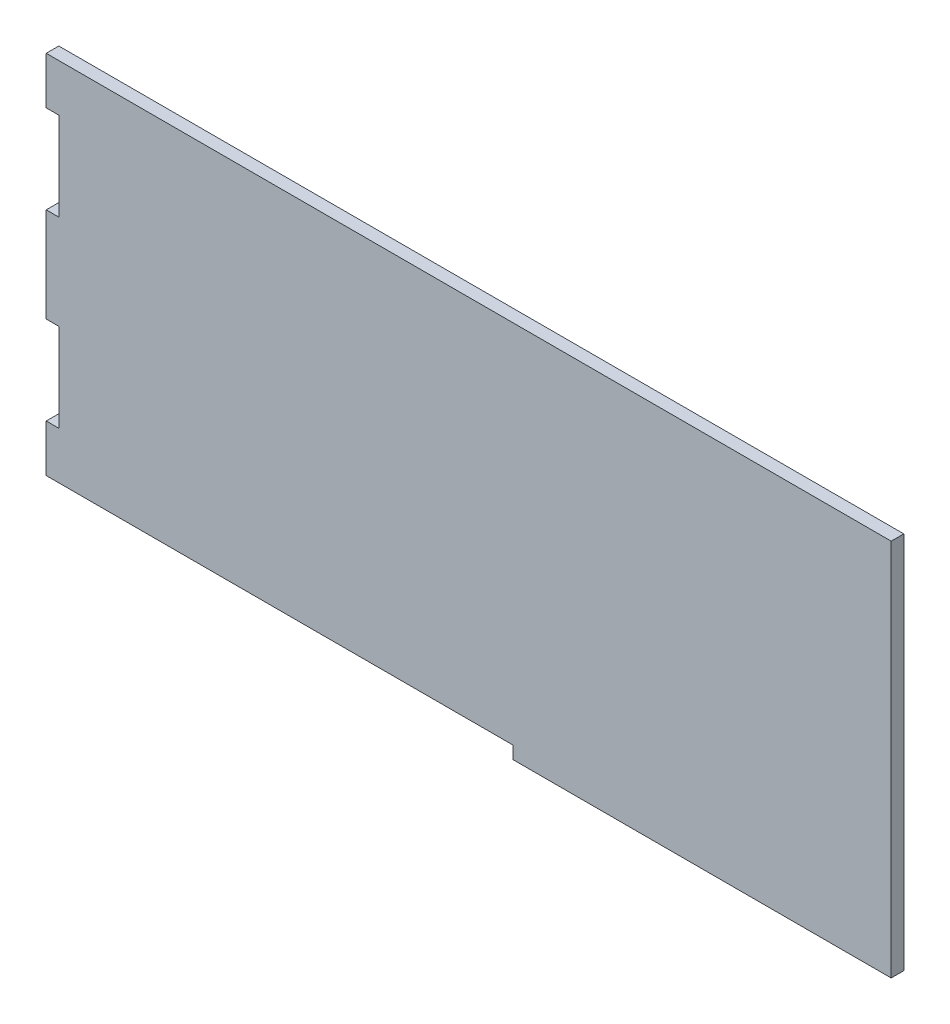
ISO-10303-21;
HEADER;
FILE_DESCRIPTION(('STEP AP214'),'2;1');
FILE_NAME('part.step','',(''),(''),'','','');
FILE_SCHEMA(('AUTOMOTIVE_DESIGN { 1 0 10303 214 1 1 1 1 }'));
ENDSEC;
DATA;
#1=APPLICATION_CONTEXT('core data for automotive mechanical design processes');
#2=APPLICATION_PROTOCOL_DEFINITION('international standard','automotive_design',2000,#1);
#3=PRODUCT_CONTEXT('',#1,'mechanical');
#4=PRODUCT('Part','Part','',(#3));
#5=PRODUCT_RELATED_PRODUCT_CATEGORY('part','',(#4));
#6=PRODUCT_DEFINITION_FORMATION('','',#4);
#7=PRODUCT_DEFINITION_CONTEXT('part definition',#1,'design');
#8=PRODUCT_DEFINITION('design','',#6,#7);
#9=PRODUCT_DEFINITION_SHAPE('','',#8);
#10=(LENGTH_UNIT() NAMED_UNIT(*) SI_UNIT(.MILLI.,.METRE.));
#11=(NAMED_UNIT(*) PLANE_ANGLE_UNIT() SI_UNIT($,.RADIAN.));
#12=(NAMED_UNIT(*) SI_UNIT($,.STERADIAN.) SOLID_ANGLE_UNIT());
#13=UNCERTAINTY_MEASURE_WITH_UNIT(LENGTH_MEASURE(1.E-05),#10,'distance_accuracy_value','');
#14=(GEOMETRIC_REPRESENTATION_CONTEXT(3) GLOBAL_UNCERTAINTY_ASSIGNED_CONTEXT((#13)) GLOBAL_UNIT_ASSIGNED_CONTEXT((#10,
#11,#12)) REPRESENTATION_CONTEXT('',''));
#15=CARTESIAN_POINT('',(0.,0.,0.));
#16=DIRECTION('',(0.,0.,1.));
#17=DIRECTION('',(1.,0.,0.));
#18=AXIS2_PLACEMENT_3D('',#15,#16,#17);
#19=CARTESIAN_POINT('',(0.,0.,5.));
#20=DIRECTION('',(-1.,0.,0.));
#21=DIRECTION('',(0.,0.,1.));
#22=AXIS2_PLACEMENT_3D('',#19,#20,#21);
#23=PLANE('',#22);
#24=DIRECTION('',(0.,1.,0.));
#25=VECTOR('',#24,1.);
#26=CARTESIAN_POINT('',(0.,0.,0.));
#27=LINE('',#26,#25);
#28=CARTESIAN_POINT('',(-4.44089209850063E-13,53.75,0.));
#29=VERTEX_POINT('',#28);
#30=CARTESIAN_POINT('',(-4.44089209850063E-13,91.25,0.));
#31=VERTEX_POINT('',#30);
#32=EDGE_CURVE('E181',#29,#31,#27,.T.);
#33=ORIENTED_EDGE('',*,*,#32,.F.);
#34=DIRECTION('',(0.,0.,1.));
#35=VECTOR('',#34,1.);
#36=CARTESIAN_POINT('',(-4.44089209850063E-13,53.75,0.));
#37=LINE('',#36,#35);
#38=CARTESIAN_POINT('',(-4.44089209850063E-13,53.75,5.));
#39=VERTEX_POINT('',#38);
#40=EDGE_CURVE('E212',#29,#39,#37,.T.);
#41=ORIENTED_EDGE('',*,*,#40,.T.);
#42=DIRECTION('',(0.,1.,0.));
#43=VECTOR('',#42,1.);
#44=CARTESIAN_POINT('',(0.,0.,5.));
#45=LINE('',#44,#43);
#46=CARTESIAN_POINT('',(-4.44089209850063E-13,91.25,5.));
#47=VERTEX_POINT('',#46);
#48=EDGE_CURVE('E157',#39,#47,#45,.T.);
#49=ORIENTED_EDGE('',*,*,#48,.T.);
#50=DIRECTION('',(0.,0.,1.));
#51=VECTOR('',#50,1.);
#52=CARTESIAN_POINT('',(-4.44089209850063E-13,91.25,0.));
#53=LINE('',#52,#51);
#54=EDGE_CURVE('E214',#31,#47,#53,.T.);
#55=ORIENTED_EDGE('',*,*,#54,.F.);
#56=EDGE_LOOP('',(#33,#41,#49,#55));
#57=FACE_BOUND('',#56,.T.);
#58=ADVANCED_FACE('F35',(#57),#23,.T.);
#59=CARTESIAN_POINT('',(-4.44089209850063E-13,126.25,0.));
#60=VERTEX_POINT('',#59);
#61=CARTESIAN_POINT('',(0.,145.,0.));
#62=VERTEX_POINT('',#61);
#63=EDGE_CURVE('E175',#60,#62,#27,.T.);
#64=ORIENTED_EDGE('',*,*,#63,.F.);
#65=DIRECTION('',(0.,0.,1.));
#66=VECTOR('',#65,1.);
#67=CARTESIAN_POINT('',(-4.44089209850063E-13,126.25,0.));
#68=LINE('',#67,#66);
#69=CARTESIAN_POINT('',(-4.44089209850063E-13,126.25,5.));
#70=VERTEX_POINT('',#69);
#71=EDGE_CURVE('E227',#60,#70,#68,.T.);
#72=ORIENTED_EDGE('',*,*,#71,.T.);
#73=CARTESIAN_POINT('',(0.,145.,5.));
#74=VERTEX_POINT('',#73);
#75=EDGE_CURVE('E154',#70,#74,#45,.T.);
#76=ORIENTED_EDGE('',*,*,#75,.T.);
#77=DIRECTION('',(0.,0.,-1.));
#78=VECTOR('',#77,1.);
#79=CARTESIAN_POINT('',(0.,145.,5.));
#80=LINE('',#79,#78);
#81=EDGE_CURVE('E43',#74,#62,#80,.T.);
#82=ORIENTED_EDGE('',*,*,#81,.T.);
#83=EDGE_LOOP('',(#64,#72,#76,#82));
#84=FACE_BOUND('',#83,.T.);
#85=ADVANCED_FACE('F193',(#84),#23,.T.);
#86=CARTESIAN_POINT('',(0.,0.,5.));
#87=DIRECTION('',(0.,0.,1.));
#88=DIRECTION('',(1.,0.,0.));
#89=AXIS2_PLACEMENT_3D('',#86,#87,#88);
#90=PLANE('',#89);
#91=DIRECTION('',(0.,-1.,0.));
#92=VECTOR('',#91,1.);
#93=CARTESIAN_POINT('',(335.,-5.,5.));
#94=LINE('',#93,#92);
#95=CARTESIAN_POINT('',(335.,145.,5.));
#96=VERTEX_POINT('',#95);
#97=CARTESIAN_POINT('',(335.,-5.,5.));
#98=VERTEX_POINT('',#97);
#99=EDGE_CURVE('E49',#96,#98,#94,.T.);
#100=ORIENTED_EDGE('',*,*,#99,.F.);
#101=DIRECTION('',(1.,0.,0.));
#102=VECTOR('',#101,1.);
#103=CARTESIAN_POINT('',(0.,145.,5.));
#104=LINE('',#103,#102);
#105=EDGE_CURVE('E148',#74,#96,#104,.T.);
#106=ORIENTED_EDGE('',*,*,#105,.F.);
#107=ORIENTED_EDGE('',*,*,#75,.F.);
#108=DIRECTION('',(1.,0.,0.));
#109=VECTOR('',#108,1.);
#110=CARTESIAN_POINT('',(-4.44089209850063E-13,126.25,5.));
#111=LINE('',#110,#109);
#112=CARTESIAN_POINT('',(4.99999999999945,126.25,5.));
#113=VERTEX_POINT('',#112);
#114=EDGE_CURVE('E230',#70,#113,#111,.T.);
#115=ORIENTED_EDGE('',*,*,#114,.T.);
#116=DIRECTION('',(0.,-1.,0.));
#117=VECTOR('',#116,1.);
#118=CARTESIAN_POINT('',(4.99999999999945,126.25,5.));
#119=LINE('',#118,#117);
#120=CARTESIAN_POINT('',(4.99999999999945,91.25,5.));
#121=VERTEX_POINT('',#120);
#122=EDGE_CURVE('E233',#113,#121,#119,.T.);
#123=ORIENTED_EDGE('',*,*,#122,.T.);
#124=DIRECTION('',(1.,0.,0.));
#125=VECTOR('',#124,1.);
#126=CARTESIAN_POINT('',(-4.44089209850063E-13,91.25,5.));
#127=LINE('',#126,#125);
#128=EDGE_CURVE('E176',#47,#121,#127,.T.);
#129=ORIENTED_EDGE('',*,*,#128,.F.);
#130=ORIENTED_EDGE('',*,*,#48,.F.);
#131=DIRECTION('',(1.,0.,0.));
#132=VECTOR('',#131,1.);
#133=CARTESIAN_POINT('',(-4.44089209850063E-13,53.75,5.));
#134=LINE('',#133,#132);
#135=CARTESIAN_POINT('',(4.99999999999945,53.75,5.));
#136=VERTEX_POINT('',#135);
#137=EDGE_CURVE('E246',#39,#136,#134,.T.);
#138=ORIENTED_EDGE('',*,*,#137,.T.);
#139=DIRECTION('',(0.,1.,0.));
#140=VECTOR('',#139,1.);
#141=CARTESIAN_POINT('',(4.99999999999945,18.75,5.));
#142=LINE('',#141,#140);
#143=CARTESIAN_POINT('',(4.99999999999945,18.75,5.));
#144=VERTEX_POINT('',#143);
#145=EDGE_CURVE('E249',#144,#136,#142,.T.);
#146=ORIENTED_EDGE('',*,*,#145,.F.);
#147=DIRECTION('',(1.,0.,0.));
#148=VECTOR('',#147,1.);
#149=CARTESIAN_POINT('',(-4.44089209850063E-13,18.75,5.));
#150=LINE('',#149,#148);
#151=CARTESIAN_POINT('',(-4.44089209850063E-13,18.75,5.));
#152=VERTEX_POINT('',#151);
#153=EDGE_CURVE('E229',#152,#144,#150,.T.);
#154=ORIENTED_EDGE('',*,*,#153,.F.);
#155=CARTESIAN_POINT('',(0.,0.,5.));
#156=VERTEX_POINT('',#155);
#157=EDGE_CURVE('E159',#156,#152,#45,.T.);
#158=ORIENTED_EDGE('',*,*,#157,.F.);
#159=DIRECTION('',(1.,0.,0.));
#160=VECTOR('',#159,1.);
#161=CARTESIAN_POINT('',(0.,0.,5.));
#162=LINE('',#161,#160);
#163=CARTESIAN_POINT('',(185.,0.,5.));
#164=VERTEX_POINT('',#163);
#165=EDGE_CURVE('E167',#156,#164,#162,.T.);
#166=ORIENTED_EDGE('',*,*,#165,.T.);
#167=DIRECTION('',(0.,-1.,0.));
#168=VECTOR('',#167,1.);
#169=CARTESIAN_POINT('',(185.,0.,5.));
#170=LINE('',#169,#168);
#171=CARTESIAN_POINT('',(185.,-5.,5.));
#172=VERTEX_POINT('',#171);
#173=EDGE_CURVE('E169',#164,#172,#170,.T.);
#174=ORIENTED_EDGE('',*,*,#173,.T.);
#175=DIRECTION('',(-1.,0.,0.));
#176=VECTOR('',#175,1.);
#177=CARTESIAN_POINT('',(0.,-5.,5.));
#178=LINE('',#177,#176);
#179=EDGE_CURVE('E150',#98,#172,#178,.T.);
#180=ORIENTED_EDGE('',*,*,#179,.F.);
#181=EDGE_LOOP('',(#100,#106,#107,#115,#123,#129,#130,#138,#146,#154,#158,#166,#174,#180));
#182=FACE_BOUND('',#181,.T.);
#183=ADVANCED_FACE('F146',(#182),#90,.T.);
#184=CARTESIAN_POINT('',(0.,0.,0.));
#185=DIRECTION('',(0.,0.,1.));
#186=DIRECTION('',(1.,0.,0.));
#187=AXIS2_PLACEMENT_3D('',#184,#185,#186);
#188=PLANE('',#187);
#189=DIRECTION('',(1.,0.,0.));
#190=VECTOR('',#189,1.);
#191=CARTESIAN_POINT('',(0.,145.,0.));
#192=LINE('',#191,#190);
#193=CARTESIAN_POINT('',(335.,145.,0.));
#194=VERTEX_POINT('',#193);
#195=EDGE_CURVE('E173',#62,#194,#192,.T.);
#196=ORIENTED_EDGE('',*,*,#195,.T.);
#197=DIRECTION('',(0.,-1.,0.));
#198=VECTOR('',#197,1.);
#199=CARTESIAN_POINT('',(335.,1.23974904416476E-13,0.));
#200=LINE('',#199,#198);
#201=CARTESIAN_POINT('',(335.,-5.,0.));
#202=VERTEX_POINT('',#201);
#203=EDGE_CURVE('E137',#194,#202,#200,.T.);
#204=ORIENTED_EDGE('',*,*,#203,.T.);
#205=DIRECTION('',(-1.,0.,0.));
#206=VECTOR('',#205,1.);
#207=CARTESIAN_POINT('',(0.,-5.,0.));
#208=LINE('',#207,#206);
#209=CARTESIAN_POINT('',(185.,-5.,0.));
#210=VERTEX_POINT('',#209);
#211=EDGE_CURVE('E155',#202,#210,#208,.T.);
#212=ORIENTED_EDGE('',*,*,#211,.T.);
#213=DIRECTION('',(0.,-1.,0.));
#214=VECTOR('',#213,1.);
#215=CARTESIAN_POINT('',(185.,0.,0.));
#216=LINE('',#215,#214);
#217=CARTESIAN_POINT('',(185.,0.,0.));
#218=VERTEX_POINT('',#217);
#219=EDGE_CURVE('E160',#218,#210,#216,.T.);
#220=ORIENTED_EDGE('',*,*,#219,.F.);
#221=DIRECTION('',(1.,0.,0.));
#222=VECTOR('',#221,1.);
#223=CARTESIAN_POINT('',(0.,0.,0.));
#224=LINE('',#223,#222);
#225=CARTESIAN_POINT('',(0.,0.,0.));
#226=VERTEX_POINT('',#225);
#227=EDGE_CURVE('E180',#226,#218,#224,.T.);
#228=ORIENTED_EDGE('',*,*,#227,.F.);
#229=CARTESIAN_POINT('',(-4.44089209850063E-13,18.75,0.));
#230=VERTEX_POINT('',#229);
#231=EDGE_CURVE('E177',#226,#230,#27,.T.);
#232=ORIENTED_EDGE('',*,*,#231,.T.);
#233=DIRECTION('',(1.,0.,0.));
#234=VECTOR('',#233,1.);
#235=CARTESIAN_POINT('',(-4.44089209850063E-13,18.75,0.));
#236=LINE('',#235,#234);
#237=CARTESIAN_POINT('',(4.99999999999945,18.75,0.));
#238=VERTEX_POINT('',#237);
#239=EDGE_CURVE('E163',#230,#238,#236,.T.);
#240=ORIENTED_EDGE('',*,*,#239,.T.);
#241=DIRECTION('',(0.,1.,0.));
#242=VECTOR('',#241,1.);
#243=CARTESIAN_POINT('',(4.99999999999945,18.75,0.));
#244=LINE('',#243,#242);
#245=CARTESIAN_POINT('',(4.99999999999945,53.75,0.));
#246=VERTEX_POINT('',#245);
#247=EDGE_CURVE('E253',#238,#246,#244,.T.);
#248=ORIENTED_EDGE('',*,*,#247,.T.);
#249=DIRECTION('',(1.,0.,0.));
#250=VECTOR('',#249,1.);
#251=CARTESIAN_POINT('',(-4.44089209850063E-13,53.75,0.));
#252=LINE('',#251,#250);
#253=EDGE_CURVE('E207',#29,#246,#252,.T.);
#254=ORIENTED_EDGE('',*,*,#253,.F.);
#255=ORIENTED_EDGE('',*,*,#32,.T.);
#256=DIRECTION('',(1.,0.,0.));
#257=VECTOR('',#256,1.);
#258=CARTESIAN_POINT('',(-4.44089209850063E-13,91.25,0.));
#259=LINE('',#258,#257);
#260=CARTESIAN_POINT('',(4.99999999999945,91.25,0.));
#261=VERTEX_POINT('',#260);
#262=EDGE_CURVE('E205',#31,#261,#259,.T.);
#263=ORIENTED_EDGE('',*,*,#262,.T.);
#264=DIRECTION('',(0.,-1.,0.));
#265=VECTOR('',#264,1.);
#266=CARTESIAN_POINT('',(4.99999999999945,126.25,0.));
#267=LINE('',#266,#265);
#268=CARTESIAN_POINT('',(4.99999999999945,126.25,0.));
#269=VERTEX_POINT('',#268);
#270=EDGE_CURVE('E220',#269,#261,#267,.T.);
#271=ORIENTED_EDGE('',*,*,#270,.F.);
#272=DIRECTION('',(1.,0.,0.));
#273=VECTOR('',#272,1.);
#274=CARTESIAN_POINT('',(-4.44089209850063E-13,126.25,0.));
#275=LINE('',#274,#273);
#276=EDGE_CURVE('E200',#60,#269,#275,.T.);
#277=ORIENTED_EDGE('',*,*,#276,.F.);
#278=ORIENTED_EDGE('',*,*,#63,.T.);
#279=EDGE_LOOP('',(#196,#204,#212,#220,#228,#232,#240,#248,#254,#255,#263,#271,#277,#278));
#280=FACE_BOUND('',#279,.T.);
#281=ADVANCED_FACE('F196',(#280),#188,.F.);
#282=CARTESIAN_POINT('',(0.,145.,5.));
#283=DIRECTION('',(0.,1.,0.));
#284=DIRECTION('',(0.,0.,1.));
#285=AXIS2_PLACEMENT_3D('',#282,#283,#284);
#286=PLANE('',#285);
#287=DIRECTION('',(0.,0.,1.));
#288=VECTOR('',#287,1.);
#289=CARTESIAN_POINT('',(335.,145.,-5.));
#290=LINE('',#289,#288);
#291=EDGE_CURVE('E134',#194,#96,#290,.T.);
#292=ORIENTED_EDGE('',*,*,#291,.F.);
#293=ORIENTED_EDGE('',*,*,#195,.F.);
#294=ORIENTED_EDGE('',*,*,#81,.F.);
#295=ORIENTED_EDGE('',*,*,#105,.T.);
#296=EDGE_LOOP('',(#292,#293,#294,#295));
#297=FACE_BOUND('',#296,.T.);
#298=ADVANCED_FACE('F37',(#297),#286,.T.);
#299=DIRECTION('',(0.,0.,1.));
#300=VECTOR('',#299,1.);
#301=CARTESIAN_POINT('',(-4.44089209850063E-13,18.75,0.));
#302=LINE('',#301,#300);
#303=EDGE_CURVE('E244',#230,#152,#302,.T.);
#304=ORIENTED_EDGE('',*,*,#303,.F.);
#305=ORIENTED_EDGE('',*,*,#231,.F.);
#306=DIRECTION('',(0.,0.,-1.));
#307=VECTOR('',#306,1.);
#308=CARTESIAN_POINT('',(0.,0.,5.));
#309=LINE('',#308,#307);
#310=EDGE_CURVE('E190',#156,#226,#309,.T.);
#311=ORIENTED_EDGE('',*,*,#310,.F.);
#312=ORIENTED_EDGE('',*,*,#157,.T.);
#313=EDGE_LOOP('',(#304,#305,#311,#312));
#314=FACE_BOUND('',#313,.T.);
#315=ADVANCED_FACE('F262',(#314),#23,.T.);
#316=CARTESIAN_POINT('',(0.,0.,5.));
#317=DIRECTION('',(0.,1.,0.));
#318=DIRECTION('',(0.,0.,1.));
#319=AXIS2_PLACEMENT_3D('',#316,#317,#318);
#320=PLANE('',#319);
#321=ORIENTED_EDGE('',*,*,#227,.T.);
#322=DIRECTION('',(0.,0.,-1.));
#323=VECTOR('',#322,1.);
#324=CARTESIAN_POINT('',(185.,0.,5.));
#325=LINE('',#324,#323);
#326=EDGE_CURVE('E187',#164,#218,#325,.T.);
#327=ORIENTED_EDGE('',*,*,#326,.F.);
#328=ORIENTED_EDGE('',*,*,#165,.F.);
#329=ORIENTED_EDGE('',*,*,#310,.T.);
#330=EDGE_LOOP('',(#321,#327,#328,#329));
#331=FACE_BOUND('',#330,.T.);
#332=ADVANCED_FACE('F286',(#331),#320,.F.);
#333=CARTESIAN_POINT('',(185.,0.,5.));
#334=DIRECTION('',(1.,0.,0.));
#335=DIRECTION('',(0.,0.,-1.));
#336=AXIS2_PLACEMENT_3D('',#333,#334,#335);
#337=PLANE('',#336);
#338=ORIENTED_EDGE('',*,*,#219,.T.);
#339=DIRECTION('',(0.,0.,-1.));
#340=VECTOR('',#339,1.);
#341=CARTESIAN_POINT('',(185.,-5.,5.));
#342=LINE('',#341,#340);
#343=EDGE_CURVE('E172',#172,#210,#342,.T.);
#344=ORIENTED_EDGE('',*,*,#343,.F.);
#345=ORIENTED_EDGE('',*,*,#173,.F.);
#346=ORIENTED_EDGE('',*,*,#326,.T.);
#347=EDGE_LOOP('',(#338,#344,#345,#346));
#348=FACE_BOUND('',#347,.T.);
#349=ADVANCED_FACE('F291',(#348),#337,.F.);
#350=CARTESIAN_POINT('',(0.,-5.,5.));
#351=DIRECTION('',(0.,-1.,0.));
#352=DIRECTION('',(0.,0.,-1.));
#353=AXIS2_PLACEMENT_3D('',#350,#351,#352);
#354=PLANE('',#353);
#355=DIRECTION('',(0.,0.,-1.));
#356=VECTOR('',#355,1.);
#357=CARTESIAN_POINT('',(335.,-5.,5.));
#358=LINE('',#357,#356);
#359=EDGE_CURVE('E11',#98,#202,#358,.T.);
#360=ORIENTED_EDGE('',*,*,#359,.F.);
#361=ORIENTED_EDGE('',*,*,#179,.T.);
#362=ORIENTED_EDGE('',*,*,#343,.T.);
#363=ORIENTED_EDGE('',*,*,#211,.F.);
#364=EDGE_LOOP('',(#360,#361,#362,#363));
#365=FACE_BOUND('',#364,.T.);
#366=ADVANCED_FACE('F304',(#365),#354,.T.);
#367=CARTESIAN_POINT('',(-4.44089209850063E-13,126.25,0.));
#368=DIRECTION('',(0.,-1.,0.));
#369=DIRECTION('',(0.,0.,-1.));
#370=AXIS2_PLACEMENT_3D('',#367,#368,#369);
#371=PLANE('',#370);
#372=ORIENTED_EDGE('',*,*,#114,.F.);
#373=ORIENTED_EDGE('',*,*,#71,.F.);
#374=ORIENTED_EDGE('',*,*,#276,.T.);
#375=DIRECTION('',(0.,0.,1.));
#376=VECTOR('',#375,1.);
#377=CARTESIAN_POINT('',(4.99999999999945,126.25,0.));
#378=LINE('',#377,#376);
#379=EDGE_CURVE('E222',#269,#113,#378,.T.);
#380=ORIENTED_EDGE('',*,*,#379,.T.);
#381=EDGE_LOOP('',(#372,#373,#374,#380));
#382=FACE_BOUND('',#381,.T.);
#383=ADVANCED_FACE('F306',(#382),#371,.T.);
#384=CARTESIAN_POINT('',(4.99999999999945,126.25,0.));
#385=DIRECTION('',(-1.,0.,0.));
#386=DIRECTION('',(0.,0.,1.));
#387=AXIS2_PLACEMENT_3D('',#384,#385,#386);
#388=PLANE('',#387);
#389=ORIENTED_EDGE('',*,*,#122,.F.);
#390=ORIENTED_EDGE('',*,*,#379,.F.);
#391=ORIENTED_EDGE('',*,*,#270,.T.);
#392=DIRECTION('',(0.,0.,1.));
#393=VECTOR('',#392,1.);
#394=CARTESIAN_POINT('',(4.99999999999945,91.25,0.));
#395=LINE('',#394,#393);
#396=EDGE_CURVE('E218',#261,#121,#395,.T.);
#397=ORIENTED_EDGE('',*,*,#396,.T.);
#398=EDGE_LOOP('',(#389,#390,#391,#397));
#399=FACE_BOUND('',#398,.T.);
#400=ADVANCED_FACE('F348',(#399),#388,.T.);
#401=CARTESIAN_POINT('',(-4.44089209850063E-13,91.25,0.));
#402=DIRECTION('',(0.,-1.,0.));
#403=DIRECTION('',(0.,0.,-1.));
#404=AXIS2_PLACEMENT_3D('',#401,#402,#403);
#405=PLANE('',#404);
#406=ORIENTED_EDGE('',*,*,#128,.T.);
#407=ORIENTED_EDGE('',*,*,#396,.F.);
#408=ORIENTED_EDGE('',*,*,#262,.F.);
#409=ORIENTED_EDGE('',*,*,#54,.T.);
#410=EDGE_LOOP('',(#406,#407,#408,#409));
#411=FACE_BOUND('',#410,.T.);
#412=ADVANCED_FACE('F355',(#411),#405,.F.);
#413=CARTESIAN_POINT('',(-4.44089209850063E-13,18.75,0.));
#414=DIRECTION('',(0.,-1.,0.));
#415=DIRECTION('',(0.,0.,-1.));
#416=AXIS2_PLACEMENT_3D('',#413,#414,#415);
#417=PLANE('',#416);
#418=ORIENTED_EDGE('',*,*,#153,.T.);
#419=DIRECTION('',(0.,0.,1.));
#420=VECTOR('',#419,1.);
#421=CARTESIAN_POINT('',(4.99999999999945,18.75,0.));
#422=LINE('',#421,#420);
#423=EDGE_CURVE('E240',#238,#144,#422,.T.);
#424=ORIENTED_EDGE('',*,*,#423,.F.);
#425=ORIENTED_EDGE('',*,*,#239,.F.);
#426=ORIENTED_EDGE('',*,*,#303,.T.);
#427=EDGE_LOOP('',(#418,#424,#425,#426));
#428=FACE_BOUND('',#427,.T.);
#429=ADVANCED_FACE('F259',(#428),#417,.F.);
#430=CARTESIAN_POINT('',(-4.44089209850063E-13,53.75,0.));
#431=DIRECTION('',(0.,-1.,0.));
#432=DIRECTION('',(0.,0.,-1.));
#433=AXIS2_PLACEMENT_3D('',#430,#431,#432);
#434=PLANE('',#433);
#435=ORIENTED_EDGE('',*,*,#137,.F.);
#436=ORIENTED_EDGE('',*,*,#40,.F.);
#437=ORIENTED_EDGE('',*,*,#253,.T.);
#438=DIRECTION('',(0.,0.,1.));
#439=VECTOR('',#438,1.);
#440=CARTESIAN_POINT('',(4.99999999999945,53.75,0.));
#441=LINE('',#440,#439);
#442=EDGE_CURVE('E57',#246,#136,#441,.T.);
#443=ORIENTED_EDGE('',*,*,#442,.T.);
#444=EDGE_LOOP('',(#435,#436,#437,#443));
#445=FACE_BOUND('',#444,.T.);
#446=ADVANCED_FACE('F269',(#445),#434,.T.);
#447=CARTESIAN_POINT('',(4.99999999999945,18.75,0.));
#448=DIRECTION('',(1.,0.,0.));
#449=DIRECTION('',(0.,0.,-1.));
#450=AXIS2_PLACEMENT_3D('',#447,#448,#449);
#451=PLANE('',#450);
#452=ORIENTED_EDGE('',*,*,#145,.T.);
#453=ORIENTED_EDGE('',*,*,#442,.F.);
#454=ORIENTED_EDGE('',*,*,#247,.F.);
#455=ORIENTED_EDGE('',*,*,#423,.T.);
#456=EDGE_LOOP('',(#452,#453,#454,#455));
#457=FACE_BOUND('',#456,.T.);
#458=ADVANCED_FACE('F267',(#457),#451,.F.);
#459=CARTESIAN_POINT('',(335.,-5.,-5.));
#460=DIRECTION('',(-1.,0.,0.));
#461=DIRECTION('',(0.,-1.,0.));
#462=AXIS2_PLACEMENT_3D('',#459,#460,#461);
#463=PLANE('',#462);
#464=ORIENTED_EDGE('',*,*,#291,.T.);
#465=ORIENTED_EDGE('',*,*,#99,.T.);
#466=ORIENTED_EDGE('',*,*,#359,.T.);
#467=ORIENTED_EDGE('',*,*,#203,.F.);
#468=EDGE_LOOP('',(#464,#465,#466,#467));
#469=FACE_BOUND('',#468,.T.);
#470=ADVANCED_FACE('F135',(#469),#463,.F.);
#471=CLOSED_SHELL('',(#58,#85,#183,#281,#298,#315,#332,#349,#366,#383,#400,#412,#429,#446,#458,#470));
#472=MANIFOLD_SOLID_BREP('B2',#471);
#473=ADVANCED_BREP_SHAPE_REPRESENTATION('',(#18,#472),#14);
#474=SHAPE_DEFINITION_REPRESENTATION(#9,#473);
ENDSEC;
END-ISO-10303-21;
